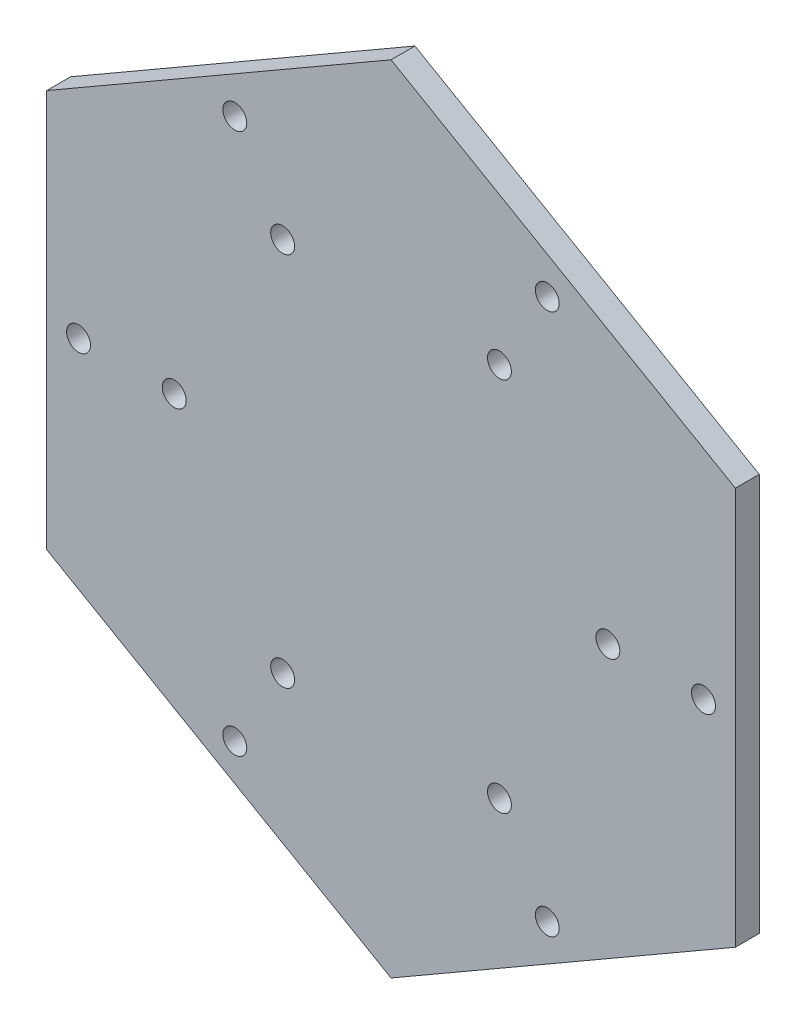
ISO-10303-21;
HEADER;
FILE_DESCRIPTION(('STEP AP214'),'2;1');
FILE_NAME('part.step','',(''),(''),'','','');
FILE_SCHEMA(('AUTOMOTIVE_DESIGN { 1 0 10303 214 1 1 1 1 }'));
ENDSEC;
DATA;
#1=APPLICATION_CONTEXT('core data for automotive mechanical design processes');
#2=APPLICATION_PROTOCOL_DEFINITION('international standard','automotive_design',2000,#1);
#3=PRODUCT_CONTEXT('',#1,'mechanical');
#4=PRODUCT('Part','Part','',(#3));
#5=PRODUCT_RELATED_PRODUCT_CATEGORY('part','',(#4));
#6=PRODUCT_DEFINITION_FORMATION('','',#4);
#7=PRODUCT_DEFINITION_CONTEXT('part definition',#1,'design');
#8=PRODUCT_DEFINITION('design','',#6,#7);
#9=PRODUCT_DEFINITION_SHAPE('','',#8);
#10=(LENGTH_UNIT() NAMED_UNIT(*) SI_UNIT(.MILLI.,.METRE.));
#11=(NAMED_UNIT(*) PLANE_ANGLE_UNIT() SI_UNIT($,.RADIAN.));
#12=(NAMED_UNIT(*) SI_UNIT($,.STERADIAN.) SOLID_ANGLE_UNIT());
#13=UNCERTAINTY_MEASURE_WITH_UNIT(LENGTH_MEASURE(1.E-05),#10,'distance_accuracy_value','');
#14=(GEOMETRIC_REPRESENTATION_CONTEXT(3) GLOBAL_UNCERTAINTY_ASSIGNED_CONTEXT((#13)) GLOBAL_UNIT_ASSIGNED_CONTEXT((#10,
#11,#12)) REPRESENTATION_CONTEXT('',''));
#15=CARTESIAN_POINT('',(0.,0.,0.));
#16=DIRECTION('',(0.,0.,1.));
#17=DIRECTION('',(1.,0.,0.));
#18=AXIS2_PLACEMENT_3D('',#15,#16,#17);
#19=CARTESIAN_POINT('',(-43.2066526290992,-24.9453725261938,3.));
#20=DIRECTION('',(0.499999999999995,0.866025403784441,0.));
#21=DIRECTION('',(-0.866025403784442,0.499999999999995,0.));
#22=AXIS2_PLACEMENT_3D('',#19,#20,#21);
#23=PLANE('',#22);
#24=DIRECTION('',(0.866025403784442,-0.499999999999995,0.));
#25=VECTOR('',#24,1.);
#26=CARTESIAN_POINT('',(-43.2066526290992,-24.9453725261938,0.));
#27=LINE('',#26,#25);
#28=CARTESIAN_POINT('',(-43.2066526290992,-24.9453725261938,0.));
#29=VERTEX_POINT('',#28);
#30=CARTESIAN_POINT('',(0.,-49.8907450523865,0.));
#31=VERTEX_POINT('',#30);
#32=EDGE_CURVE('E128',#29,#31,#27,.T.);
#33=ORIENTED_EDGE('',*,*,#32,.T.);
#34=DIRECTION('',(0.,0.,-1.));
#35=VECTOR('',#34,1.);
#36=CARTESIAN_POINT('',(0.,-49.8907450523865,3.));
#37=LINE('',#36,#35);
#38=CARTESIAN_POINT('',(0.,-49.8907450523865,3.));
#39=VERTEX_POINT('',#38);
#40=EDGE_CURVE('E11',#39,#31,#37,.T.);
#41=ORIENTED_EDGE('',*,*,#40,.F.);
#42=DIRECTION('',(0.866025403784442,-0.499999999999995,0.));
#43=VECTOR('',#42,1.);
#44=CARTESIAN_POINT('',(-43.2066526290992,-24.9453725261938,3.));
#45=LINE('',#44,#43);
#46=CARTESIAN_POINT('',(-43.2066526290992,-24.9453725261938,3.));
#47=VERTEX_POINT('',#46);
#48=EDGE_CURVE('E145',#47,#39,#45,.T.);
#49=ORIENTED_EDGE('',*,*,#48,.F.);
#50=DIRECTION('',(0.,0.,-1.));
#51=VECTOR('',#50,1.);
#52=CARTESIAN_POINT('',(-43.2066526290992,-24.9453725261938,3.));
#53=LINE('',#52,#51);
#54=EDGE_CURVE('E124',#47,#29,#53,.T.);
#55=ORIENTED_EDGE('',*,*,#54,.T.);
#56=EDGE_LOOP('',(#33,#41,#49,#55));
#57=FACE_BOUND('',#56,.T.);
#58=ADVANCED_FACE('F39',(#57),#23,.F.);
#59=CARTESIAN_POINT('',(0.,-49.8907450523865,3.));
#60=DIRECTION('',(-0.500000000000001,0.866025403784438,0.));
#61=DIRECTION('',(-0.866025403784438,-0.500000000000001,0.));
#62=AXIS2_PLACEMENT_3D('',#59,#60,#61);
#63=PLANE('',#62);
#64=DIRECTION('',(0.866025403784438,0.500000000000001,0.));
#65=VECTOR('',#64,1.);
#66=CARTESIAN_POINT('',(0.,-49.8907450523865,0.));
#67=LINE('',#66,#65);
#68=CARTESIAN_POINT('',(43.2066526290996,-24.9453725261932,0.));
#69=VERTEX_POINT('',#68);
#70=EDGE_CURVE('E132',#31,#69,#67,.T.);
#71=ORIENTED_EDGE('',*,*,#70,.T.);
#72=DIRECTION('',(0.,0.,-1.));
#73=VECTOR('',#72,1.);
#74=CARTESIAN_POINT('',(43.2066526290996,-24.9453725261932,3.));
#75=LINE('',#74,#73);
#76=CARTESIAN_POINT('',(43.2066526290996,-24.9453725261932,3.));
#77=VERTEX_POINT('',#76);
#78=EDGE_CURVE('E48',#77,#69,#75,.T.);
#79=ORIENTED_EDGE('',*,*,#78,.F.);
#80=DIRECTION('',(0.866025403784438,0.500000000000001,0.));
#81=VECTOR('',#80,1.);
#82=CARTESIAN_POINT('',(0.,-49.8907450523865,3.));
#83=LINE('',#82,#81);
#84=EDGE_CURVE('E93',#39,#77,#83,.T.);
#85=ORIENTED_EDGE('',*,*,#84,.F.);
#86=ORIENTED_EDGE('',*,*,#40,.T.);
#87=EDGE_LOOP('',(#71,#79,#85,#86));
#88=FACE_BOUND('',#87,.T.);
#89=ADVANCED_FACE('F174',(#88),#63,.F.);
#90=CARTESIAN_POINT('',(43.2066526290996,-24.9453725261932,3.));
#91=DIRECTION('',(-1.,0.,0.));
#92=DIRECTION('',(0.,-1.,0.));
#93=AXIS2_PLACEMENT_3D('',#90,#91,#92);
#94=PLANE('',#93);
#95=DIRECTION('',(0.,1.,0.));
#96=VECTOR('',#95,1.);
#97=CARTESIAN_POINT('',(43.2066526290996,-24.9453725261932,0.));
#98=LINE('',#97,#96);
#99=CARTESIAN_POINT('',(43.2066526290994,24.9453725261935,0.));
#100=VERTEX_POINT('',#99);
#101=EDGE_CURVE('E136',#69,#100,#98,.T.);
#102=ORIENTED_EDGE('',*,*,#101,.T.);
#103=DIRECTION('',(0.,0.,-1.));
#104=VECTOR('',#103,1.);
#105=CARTESIAN_POINT('',(43.2066526290994,24.9453725261935,3.));
#106=LINE('',#105,#104);
#107=CARTESIAN_POINT('',(43.2066526290994,24.9453725261935,3.));
#108=VERTEX_POINT('',#107);
#109=EDGE_CURVE('E117',#108,#100,#106,.T.);
#110=ORIENTED_EDGE('',*,*,#109,.F.);
#111=DIRECTION('',(0.,1.,0.));
#112=VECTOR('',#111,1.);
#113=CARTESIAN_POINT('',(43.2066526290996,-24.9453725261932,3.));
#114=LINE('',#113,#112);
#115=EDGE_CURVE('E106',#77,#108,#114,.T.);
#116=ORIENTED_EDGE('',*,*,#115,.F.);
#117=ORIENTED_EDGE('',*,*,#78,.T.);
#118=EDGE_LOOP('',(#102,#110,#116,#117));
#119=FACE_BOUND('',#118,.T.);
#120=ADVANCED_FACE('F155',(#119),#94,.F.);
#121=CARTESIAN_POINT('',(43.2066526290994,24.9453725261935,3.));
#122=DIRECTION('',(-0.499999999999995,-0.866025403784441,0.));
#123=DIRECTION('',(0.866025403784442,-0.499999999999995,0.));
#124=AXIS2_PLACEMENT_3D('',#121,#122,#123);
#125=PLANE('',#124);
#126=DIRECTION('',(-0.866025403784442,0.499999999999995,0.));
#127=VECTOR('',#126,1.);
#128=CARTESIAN_POINT('',(43.2066526290994,24.9453725261935,0.));
#129=LINE('',#128,#127);
#130=CARTESIAN_POINT('',(-3.48385210662776E-13,49.8907450523865,0.));
#131=VERTEX_POINT('',#130);
#132=EDGE_CURVE('E115',#100,#131,#129,.T.);
#133=ORIENTED_EDGE('',*,*,#132,.T.);
#134=DIRECTION('',(0.,0.,-1.));
#135=VECTOR('',#134,1.);
#136=CARTESIAN_POINT('',(-3.48385210662776E-13,49.8907450523865,3.));
#137=LINE('',#136,#135);
#138=CARTESIAN_POINT('',(-3.48385210662776E-13,49.8907450523865,3.));
#139=VERTEX_POINT('',#138);
#140=EDGE_CURVE('E112',#139,#131,#137,.T.);
#141=ORIENTED_EDGE('',*,*,#140,.F.);
#142=DIRECTION('',(-0.866025403784442,0.499999999999995,0.));
#143=VECTOR('',#142,1.);
#144=CARTESIAN_POINT('',(43.2066526290994,24.9453725261935,3.));
#145=LINE('',#144,#143);
#146=EDGE_CURVE('E100',#108,#139,#145,.T.);
#147=ORIENTED_EDGE('',*,*,#146,.F.);
#148=ORIENTED_EDGE('',*,*,#109,.T.);
#149=EDGE_LOOP('',(#133,#141,#147,#148));
#150=FACE_BOUND('',#149,.T.);
#151=ADVANCED_FACE('F113',(#150),#125,.F.);
#152=CARTESIAN_POINT('',(-3.48385210662776E-13,49.8907450523865,3.));
#153=DIRECTION('',(0.500000000000007,-0.866025403784435,0.));
#154=DIRECTION('',(0.866025403784434,0.500000000000007,0.));
#155=AXIS2_PLACEMENT_3D('',#152,#153,#154);
#156=PLANE('',#155);
#157=DIRECTION('',(-0.866025403784435,-0.500000000000007,0.));
#158=VECTOR('',#157,1.);
#159=CARTESIAN_POINT('',(-3.48385210662776E-13,49.8907450523865,0.));
#160=LINE('',#159,#158);
#161=CARTESIAN_POINT('',(-43.2066526290997,24.9453725261929,0.));
#162=VERTEX_POINT('',#161);
#163=EDGE_CURVE('E79',#131,#162,#160,.T.);
#164=ORIENTED_EDGE('',*,*,#163,.T.);
#165=DIRECTION('',(0.,0.,-1.));
#166=VECTOR('',#165,1.);
#167=CARTESIAN_POINT('',(-43.2066526290997,24.9453725261929,3.));
#168=LINE('',#167,#166);
#169=CARTESIAN_POINT('',(-43.2066526290997,24.9453725261929,3.));
#170=VERTEX_POINT('',#169);
#171=EDGE_CURVE('E118',#170,#162,#168,.T.);
#172=ORIENTED_EDGE('',*,*,#171,.F.);
#173=DIRECTION('',(-0.866025403784435,-0.500000000000007,0.));
#174=VECTOR('',#173,1.);
#175=CARTESIAN_POINT('',(-3.48385210662776E-13,49.8907450523865,3.));
#176=LINE('',#175,#174);
#177=EDGE_CURVE('E104',#139,#170,#176,.T.);
#178=ORIENTED_EDGE('',*,*,#177,.F.);
#179=ORIENTED_EDGE('',*,*,#140,.T.);
#180=EDGE_LOOP('',(#164,#172,#178,#179));
#181=FACE_BOUND('',#180,.T.);
#182=ADVANCED_FACE('F120',(#181),#156,.F.);
#183=CARTESIAN_POINT('',(-43.2066526290997,24.9453725261929,3.));
#184=DIRECTION('',(1.,0.,0.));
#185=DIRECTION('',(0.,1.,0.));
#186=AXIS2_PLACEMENT_3D('',#183,#184,#185);
#187=PLANE('',#186);
#188=DIRECTION('',(0.,-1.,0.));
#189=VECTOR('',#188,1.);
#190=CARTESIAN_POINT('',(-43.2066526290997,24.9453725261929,0.));
#191=LINE('',#190,#189);
#192=EDGE_CURVE('E85',#162,#29,#191,.T.);
#193=ORIENTED_EDGE('',*,*,#192,.T.);
#194=ORIENTED_EDGE('',*,*,#54,.F.);
#195=DIRECTION('',(0.,-1.,0.));
#196=VECTOR('',#195,1.);
#197=CARTESIAN_POINT('',(-43.2066526290997,24.9453725261929,3.));
#198=LINE('',#197,#196);
#199=EDGE_CURVE('E56',#170,#47,#198,.T.);
#200=ORIENTED_EDGE('',*,*,#199,.F.);
#201=ORIENTED_EDGE('',*,*,#171,.T.);
#202=EDGE_LOOP('',(#193,#194,#200,#201));
#203=FACE_BOUND('',#202,.T.);
#204=ADVANCED_FACE('F162',(#203),#187,.F.);
#205=CARTESIAN_POINT('',(0.,0.,3.));
#206=DIRECTION('',(0.,0.,1.));
#207=DIRECTION('',(1.,0.,0.));
#208=AXIS2_PLACEMENT_3D('',#205,#206,#207);
#209=PLANE('',#208);
#210=CARTESIAN_POINT('',(-19.6033263145499,-33.9539571741521,3.));
#211=DIRECTION('',(0.,0.,1.));
#212=DIRECTION('',(1.,0.,0.));
#213=AXIS2_PLACEMENT_3D('',#210,#211,#212);
#214=CIRCLE('',#213,1.5);
#215=CARTESIAN_POINT('',(-18.1033263145499,-33.9539571741521,3.));
#216=VERTEX_POINT('',#215);
#217=EDGE_CURVE('E340',#216,#216,#214,.T.);
#218=ORIENTED_EDGE('',*,*,#217,.F.);
#219=EDGE_LOOP('',(#218));
#220=FACE_BOUND('',#219,.T.);
#221=CARTESIAN_POINT('',(-27.2066526290996,1.89983039893777E-13,3.));
#222=DIRECTION('',(0.,0.,1.));
#223=DIRECTION('',(1.,0.,0.));
#224=AXIS2_PLACEMENT_3D('',#221,#222,#223);
#225=CIRCLE('',#224,1.5);
#226=CARTESIAN_POINT('',(-25.7066526290996,1.89983039893777E-13,3.));
#227=VERTEX_POINT('',#226);
#228=EDGE_CURVE('E349',#227,#227,#225,.T.);
#229=ORIENTED_EDGE('',*,*,#228,.F.);
#230=EDGE_LOOP('',(#229));
#231=FACE_BOUND('',#230,.T.);
#232=CARTESIAN_POINT('',(-39.2066526290996,2.73778592026012E-13,3.));
#233=DIRECTION('',(0.,0.,1.));
#234=DIRECTION('',(1.,0.,0.));
#235=AXIS2_PLACEMENT_3D('',#232,#233,#234);
#236=CIRCLE('',#235,1.5);
#237=CARTESIAN_POINT('',(-37.7066526290996,2.73778592026012E-13,3.));
#238=VERTEX_POINT('',#237);
#239=EDGE_CURVE('E435',#238,#238,#236,.T.);
#240=ORIENTED_EDGE('',*,*,#239,.F.);
#241=EDGE_LOOP('',(#240));
#242=FACE_BOUND('',#241,.T.);
#243=CARTESIAN_POINT('',(-13.6033263145496,23.561652328739,3.));
#244=DIRECTION('',(0.,0.,1.));
#245=DIRECTION('',(1.,0.,0.));
#246=AXIS2_PLACEMENT_3D('',#243,#244,#245);
#247=CIRCLE('',#246,1.5);
#248=CARTESIAN_POINT('',(-12.1033263145496,23.561652328739,3.));
#249=VERTEX_POINT('',#248);
#250=EDGE_CURVE('E442',#249,#249,#247,.T.);
#251=ORIENTED_EDGE('',*,*,#250,.F.);
#252=EDGE_LOOP('',(#251));
#253=FACE_BOUND('',#252,.T.);
#254=CARTESIAN_POINT('',(39.2066526290996,0.,3.));
#255=DIRECTION('',(0.,0.,1.));
#256=DIRECTION('',(1.,0.,0.));
#257=AXIS2_PLACEMENT_3D('',#254,#255,#256);
#258=CIRCLE('',#257,1.5);
#259=CARTESIAN_POINT('',(40.7066526290996,0.,3.));
#260=VERTEX_POINT('',#259);
#261=EDGE_CURVE('E378',#260,#260,#258,.T.);
#262=ORIENTED_EDGE('',*,*,#261,.F.);
#263=EDGE_LOOP('',(#262));
#264=FACE_BOUND('',#263,.T.);
#265=CARTESIAN_POINT('',(13.6033263145497,-23.5616523287389,3.));
#266=DIRECTION('',(0.,0.,1.));
#267=DIRECTION('',(1.,0.,0.));
#268=AXIS2_PLACEMENT_3D('',#265,#266,#267);
#269=CIRCLE('',#268,1.5);
#270=CARTESIAN_POINT('',(15.1033263145497,-23.5616523287389,3.));
#271=VERTEX_POINT('',#270);
#272=EDGE_CURVE('E361',#271,#271,#269,.T.);
#273=ORIENTED_EDGE('',*,*,#272,.F.);
#274=EDGE_LOOP('',(#273));
#275=FACE_BOUND('',#274,.T.);
#276=CARTESIAN_POINT('',(19.6033263145497,-33.9539571741522,3.));
#277=DIRECTION('',(0.,0.,1.));
#278=DIRECTION('',(1.,0.,0.));
#279=AXIS2_PLACEMENT_3D('',#276,#277,#278);
#280=CIRCLE('',#279,1.5);
#281=CARTESIAN_POINT('',(21.1033263145497,-33.9539571741522,3.));
#282=VERTEX_POINT('',#281);
#283=EDGE_CURVE('E362',#282,#282,#280,.T.);
#284=ORIENTED_EDGE('',*,*,#283,.F.);
#285=EDGE_LOOP('',(#284));
#286=FACE_BOUND('',#285,.T.);
#287=CARTESIAN_POINT('',(-13.6033263145499,-23.5616523287389,3.));
#288=DIRECTION('',(0.,0.,1.));
#289=DIRECTION('',(1.,0.,0.));
#290=AXIS2_PLACEMENT_3D('',#287,#288,#289);
#291=CIRCLE('',#290,1.5);
#292=CARTESIAN_POINT('',(-12.1033263145499,-23.5616523287389,3.));
#293=VERTEX_POINT('',#292);
#294=EDGE_CURVE('E346',#293,#293,#291,.T.);
#295=ORIENTED_EDGE('',*,*,#294,.F.);
#296=EDGE_LOOP('',(#295));
#297=FACE_BOUND('',#296,.T.);
#298=CARTESIAN_POINT('',(-19.6033263145495,33.9539571741524,3.));
#299=DIRECTION('',(0.,0.,1.));
#300=DIRECTION('',(1.,0.,0.));
#301=AXIS2_PLACEMENT_3D('',#298,#299,#300);
#302=CIRCLE('',#301,1.50000000000001);
#303=CARTESIAN_POINT('',(-18.1033263145495,33.9539571741524,3.));
#304=VERTEX_POINT('',#303);
#305=EDGE_CURVE('E415',#304,#304,#302,.T.);
#306=ORIENTED_EDGE('',*,*,#305,.F.);
#307=EDGE_LOOP('',(#306));
#308=FACE_BOUND('',#307,.T.);
#309=CARTESIAN_POINT('',(13.6033263145501,23.5616523287388,3.));
#310=DIRECTION('',(0.,0.,1.));
#311=DIRECTION('',(1.,0.,0.));
#312=AXIS2_PLACEMENT_3D('',#309,#310,#311);
#313=CIRCLE('',#312,1.5);
#314=CARTESIAN_POINT('',(15.1033263145501,23.5616523287388,3.));
#315=VERTEX_POINT('',#314);
#316=EDGE_CURVE('E419',#315,#315,#313,.T.);
#317=ORIENTED_EDGE('',*,*,#316,.F.);
#318=EDGE_LOOP('',(#317));
#319=FACE_BOUND('',#318,.T.);
#320=CARTESIAN_POINT('',(19.6033263145502,33.953957174152,3.));
#321=DIRECTION('',(0.,0.,1.));
#322=DIRECTION('',(1.,0.,0.));
#323=AXIS2_PLACEMENT_3D('',#320,#321,#322);
#324=CIRCLE('',#323,1.50000000000001);
#325=CARTESIAN_POINT('',(21.1033263145502,33.953957174152,3.));
#326=VERTEX_POINT('',#325);
#327=EDGE_CURVE('E422',#326,#326,#324,.T.);
#328=ORIENTED_EDGE('',*,*,#327,.F.);
#329=EDGE_LOOP('',(#328));
#330=FACE_BOUND('',#329,.T.);
#331=CARTESIAN_POINT('',(27.2066526290996,0.,3.));
#332=DIRECTION('',(0.,0.,1.));
#333=DIRECTION('',(1.,0.,0.));
#334=AXIS2_PLACEMENT_3D('',#331,#332,#333);
#335=CIRCLE('',#334,1.5);
#336=CARTESIAN_POINT('',(28.7066526290996,0.,3.));
#337=VERTEX_POINT('',#336);
#338=EDGE_CURVE('E377',#337,#337,#335,.T.);
#339=ORIENTED_EDGE('',*,*,#338,.F.);
#340=EDGE_LOOP('',(#339));
#341=FACE_BOUND('',#340,.T.);
#342=ORIENTED_EDGE('',*,*,#48,.T.);
#343=ORIENTED_EDGE('',*,*,#84,.T.);
#344=ORIENTED_EDGE('',*,*,#115,.T.);
#345=ORIENTED_EDGE('',*,*,#146,.T.);
#346=ORIENTED_EDGE('',*,*,#177,.T.);
#347=ORIENTED_EDGE('',*,*,#199,.T.);
#348=EDGE_LOOP('',(#342,#343,#344,#345,#346,#347));
#349=FACE_BOUND('',#348,.T.);
#350=ADVANCED_FACE('F102',(#220,#231,#242,#253,#264,#275,#286,#297,#308,#319,#330,#341,#349),
#209,.T.);
#351=CARTESIAN_POINT('',(0.,0.,0.));
#352=DIRECTION('',(0.,0.,1.));
#353=DIRECTION('',(1.,0.,0.));
#354=AXIS2_PLACEMENT_3D('',#351,#352,#353);
#355=PLANE('',#354);
#356=CARTESIAN_POINT('',(-19.6033263145499,-33.9539571741521,0.));
#357=DIRECTION('',(0.,0.,1.));
#358=DIRECTION('',(1.,0.,0.));
#359=AXIS2_PLACEMENT_3D('',#356,#357,#358);
#360=CIRCLE('',#359,1.5);
#361=CARTESIAN_POINT('',(-18.1033263145499,-33.9539571741521,0.));
#362=VERTEX_POINT('',#361);
#363=EDGE_CURVE('E337',#362,#362,#360,.T.);
#364=ORIENTED_EDGE('',*,*,#363,.T.);
#365=EDGE_LOOP('',(#364));
#366=FACE_BOUND('',#365,.T.);
#367=CARTESIAN_POINT('',(-27.2066526290996,1.89983039893777E-13,0.));
#368=DIRECTION('',(0.,0.,1.));
#369=DIRECTION('',(1.,0.,0.));
#370=AXIS2_PLACEMENT_3D('',#367,#368,#369);
#371=CIRCLE('',#370,1.5);
#372=CARTESIAN_POINT('',(-25.7066526290996,1.89983039893777E-13,0.));
#373=VERTEX_POINT('',#372);
#374=EDGE_CURVE('E342',#373,#373,#371,.T.);
#375=ORIENTED_EDGE('',*,*,#374,.T.);
#376=EDGE_LOOP('',(#375));
#377=FACE_BOUND('',#376,.T.);
#378=CARTESIAN_POINT('',(-39.2066526290996,2.73778592026012E-13,0.));
#379=DIRECTION('',(0.,0.,1.));
#380=DIRECTION('',(1.,0.,0.));
#381=AXIS2_PLACEMENT_3D('',#378,#379,#380);
#382=CIRCLE('',#381,1.5);
#383=CARTESIAN_POINT('',(-37.7066526290996,2.73778592026012E-13,0.));
#384=VERTEX_POINT('',#383);
#385=EDGE_CURVE('E356',#384,#384,#382,.T.);
#386=ORIENTED_EDGE('',*,*,#385,.T.);
#387=EDGE_LOOP('',(#386));
#388=FACE_BOUND('',#387,.T.);
#389=CARTESIAN_POINT('',(-13.6033263145496,23.561652328739,0.));
#390=DIRECTION('',(0.,0.,1.));
#391=DIRECTION('',(1.,0.,0.));
#392=AXIS2_PLACEMENT_3D('',#389,#390,#391);
#393=CIRCLE('',#392,1.5);
#394=CARTESIAN_POINT('',(-12.1033263145496,23.561652328739,0.));
#395=VERTEX_POINT('',#394);
#396=EDGE_CURVE('E439',#395,#395,#393,.T.);
#397=ORIENTED_EDGE('',*,*,#396,.T.);
#398=EDGE_LOOP('',(#397));
#399=FACE_BOUND('',#398,.T.);
#400=CARTESIAN_POINT('',(39.2066526290996,0.,0.));
#401=DIRECTION('',(0.,0.,1.));
#402=DIRECTION('',(1.,0.,0.));
#403=AXIS2_PLACEMENT_3D('',#400,#401,#402);
#404=CIRCLE('',#403,1.5);
#405=CARTESIAN_POINT('',(40.7066526290996,0.,0.));
#406=VERTEX_POINT('',#405);
#407=EDGE_CURVE('E373',#406,#406,#404,.T.);
#408=ORIENTED_EDGE('',*,*,#407,.T.);
#409=EDGE_LOOP('',(#408));
#410=FACE_BOUND('',#409,.T.);
#411=CARTESIAN_POINT('',(13.6033263145497,-23.5616523287389,0.));
#412=DIRECTION('',(0.,0.,1.));
#413=DIRECTION('',(1.,0.,0.));
#414=AXIS2_PLACEMENT_3D('',#411,#412,#413);
#415=CIRCLE('',#414,1.5);
#416=CARTESIAN_POINT('',(15.1033263145497,-23.5616523287389,0.));
#417=VERTEX_POINT('',#416);
#418=EDGE_CURVE('E382',#417,#417,#415,.T.);
#419=ORIENTED_EDGE('',*,*,#418,.T.);
#420=EDGE_LOOP('',(#419));
#421=FACE_BOUND('',#420,.T.);
#422=CARTESIAN_POINT('',(19.6033263145497,-33.9539571741522,0.));
#423=DIRECTION('',(0.,0.,1.));
#424=DIRECTION('',(1.,0.,0.));
#425=AXIS2_PLACEMENT_3D('',#422,#423,#424);
#426=CIRCLE('',#425,1.5);
#427=CARTESIAN_POINT('',(21.1033263145497,-33.9539571741522,0.));
#428=VERTEX_POINT('',#427);
#429=EDGE_CURVE('E357',#428,#428,#426,.T.);
#430=ORIENTED_EDGE('',*,*,#429,.T.);
#431=EDGE_LOOP('',(#430));
#432=FACE_BOUND('',#431,.T.);
#433=CARTESIAN_POINT('',(-13.6033263145499,-23.5616523287389,0.));
#434=DIRECTION('',(0.,0.,1.));
#435=DIRECTION('',(1.,0.,0.));
#436=AXIS2_PLACEMENT_3D('',#433,#434,#435);
#437=CIRCLE('',#436,1.5);
#438=CARTESIAN_POINT('',(-12.1033263145499,-23.5616523287389,0.));
#439=VERTEX_POINT('',#438);
#440=EDGE_CURVE('E366',#439,#439,#437,.T.);
#441=ORIENTED_EDGE('',*,*,#440,.T.);
#442=EDGE_LOOP('',(#441));
#443=FACE_BOUND('',#442,.T.);
#444=CARTESIAN_POINT('',(-19.6033263145495,33.9539571741524,0.));
#445=DIRECTION('',(0.,0.,1.));
#446=DIRECTION('',(1.,0.,0.));
#447=AXIS2_PLACEMENT_3D('',#444,#445,#446);
#448=CIRCLE('',#447,1.50000000000001);
#449=CARTESIAN_POINT('',(-18.1033263145495,33.9539571741524,0.));
#450=VERTEX_POINT('',#449);
#451=EDGE_CURVE('E445',#450,#450,#448,.T.);
#452=ORIENTED_EDGE('',*,*,#451,.T.);
#453=EDGE_LOOP('',(#452));
#454=FACE_BOUND('',#453,.T.);
#455=CARTESIAN_POINT('',(13.6033263145501,23.5616523287388,0.));
#456=DIRECTION('',(0.,0.,1.));
#457=DIRECTION('',(1.,0.,0.));
#458=AXIS2_PLACEMENT_3D('',#455,#456,#457);
#459=CIRCLE('',#458,1.5);
#460=CARTESIAN_POINT('',(15.1033263145501,23.5616523287388,0.));
#461=VERTEX_POINT('',#460);
#462=EDGE_CURVE('E454',#461,#461,#459,.T.);
#463=ORIENTED_EDGE('',*,*,#462,.T.);
#464=EDGE_LOOP('',(#463));
#465=FACE_BOUND('',#464,.T.);
#466=CARTESIAN_POINT('',(19.6033263145502,33.953957174152,0.));
#467=DIRECTION('',(0.,0.,1.));
#468=DIRECTION('',(1.,0.,0.));
#469=AXIS2_PLACEMENT_3D('',#466,#467,#468);
#470=CIRCLE('',#469,1.50000000000001);
#471=CARTESIAN_POINT('',(21.1033263145502,33.953957174152,0.));
#472=VERTEX_POINT('',#471);
#473=EDGE_CURVE('E425',#472,#472,#470,.T.);
#474=ORIENTED_EDGE('',*,*,#473,.T.);
#475=EDGE_LOOP('',(#474));
#476=FACE_BOUND('',#475,.T.);
#477=CARTESIAN_POINT('',(27.2066526290996,0.,0.));
#478=DIRECTION('',(0.,0.,1.));
#479=DIRECTION('',(1.,0.,0.));
#480=AXIS2_PLACEMENT_3D('',#477,#478,#479);
#481=CIRCLE('',#480,1.5);
#482=CARTESIAN_POINT('',(28.7066526290996,0.,0.));
#483=VERTEX_POINT('',#482);
#484=EDGE_CURVE('E133',#483,#483,#481,.T.);
#485=ORIENTED_EDGE('',*,*,#484,.T.);
#486=EDGE_LOOP('',(#485));
#487=FACE_BOUND('',#486,.T.);
#488=ORIENTED_EDGE('',*,*,#32,.F.);
#489=ORIENTED_EDGE('',*,*,#192,.F.);
#490=ORIENTED_EDGE('',*,*,#163,.F.);
#491=ORIENTED_EDGE('',*,*,#132,.F.);
#492=ORIENTED_EDGE('',*,*,#101,.F.);
#493=ORIENTED_EDGE('',*,*,#70,.F.);
#494=EDGE_LOOP('',(#488,#489,#490,#491,#492,#493));
#495=FACE_BOUND('',#494,.T.);
#496=ADVANCED_FACE('F158',(#366,#377,#388,#399,#410,#421,#432,#443,#454,#465,#476,#487,#495),
#355,.F.);
#497=CARTESIAN_POINT('',(27.2066526290996,0.,0.));
#498=DIRECTION('',(0.,0.,1.));
#499=DIRECTION('',(1.,0.,0.));
#500=AXIS2_PLACEMENT_3D('',#497,#498,#499);
#501=CYLINDRICAL_SURFACE('',#500,1.5);
#502=ORIENTED_EDGE('',*,*,#484,.F.);
#503=EDGE_LOOP('',(#502));
#504=FACE_BOUND('',#503,.T.);
#505=ORIENTED_EDGE('',*,*,#338,.T.);
#506=EDGE_LOOP('',(#505));
#507=FACE_BOUND('',#506,.T.);
#508=ADVANCED_FACE('F211',(#504,#507),#501,.F.);
#509=CARTESIAN_POINT('',(19.6033263145502,33.953957174152,0.));
#510=DIRECTION('',(0.,0.,1.));
#511=DIRECTION('',(1.,0.,0.));
#512=AXIS2_PLACEMENT_3D('',#509,#510,#511);
#513=CYLINDRICAL_SURFACE('',#512,1.50000000000001);
#514=ORIENTED_EDGE('',*,*,#473,.F.);
#515=EDGE_LOOP('',(#514));
#516=FACE_BOUND('',#515,.T.);
#517=ORIENTED_EDGE('',*,*,#327,.T.);
#518=EDGE_LOOP('',(#517));
#519=FACE_BOUND('',#518,.T.);
#520=ADVANCED_FACE('F220',(#516,#519),#513,.F.);
#521=CARTESIAN_POINT('',(13.6033263145501,23.5616523287388,0.));
#522=DIRECTION('',(0.,0.,1.));
#523=DIRECTION('',(1.,0.,0.));
#524=AXIS2_PLACEMENT_3D('',#521,#522,#523);
#525=CYLINDRICAL_SURFACE('',#524,1.5);
#526=ORIENTED_EDGE('',*,*,#462,.F.);
#527=EDGE_LOOP('',(#526));
#528=FACE_BOUND('',#527,.T.);
#529=ORIENTED_EDGE('',*,*,#316,.T.);
#530=EDGE_LOOP('',(#529));
#531=FACE_BOUND('',#530,.T.);
#532=ADVANCED_FACE('F230',(#528,#531),#525,.F.);
#533=CARTESIAN_POINT('',(-19.6033263145495,33.9539571741524,0.));
#534=DIRECTION('',(0.,0.,1.));
#535=DIRECTION('',(1.,0.,0.));
#536=AXIS2_PLACEMENT_3D('',#533,#534,#535);
#537=CYLINDRICAL_SURFACE('',#536,1.50000000000001);
#538=ORIENTED_EDGE('',*,*,#451,.F.);
#539=EDGE_LOOP('',(#538));
#540=FACE_BOUND('',#539,.T.);
#541=ORIENTED_EDGE('',*,*,#305,.T.);
#542=EDGE_LOOP('',(#541));
#543=FACE_BOUND('',#542,.T.);
#544=ADVANCED_FACE('F240',(#540,#543),#537,.F.);
#545=CARTESIAN_POINT('',(-13.6033263145499,-23.5616523287389,0.));
#546=DIRECTION('',(0.,0.,1.));
#547=DIRECTION('',(1.,0.,0.));
#548=AXIS2_PLACEMENT_3D('',#545,#546,#547);
#549=CYLINDRICAL_SURFACE('',#548,1.5);
#550=ORIENTED_EDGE('',*,*,#440,.F.);
#551=EDGE_LOOP('',(#550));
#552=FACE_BOUND('',#551,.T.);
#553=ORIENTED_EDGE('',*,*,#294,.T.);
#554=EDGE_LOOP('',(#553));
#555=FACE_BOUND('',#554,.T.);
#556=ADVANCED_FACE('F250',(#552,#555),#549,.F.);
#557=CARTESIAN_POINT('',(19.6033263145497,-33.9539571741522,0.));
#558=DIRECTION('',(0.,0.,1.));
#559=DIRECTION('',(1.,0.,0.));
#560=AXIS2_PLACEMENT_3D('',#557,#558,#559);
#561=CYLINDRICAL_SURFACE('',#560,1.5);
#562=ORIENTED_EDGE('',*,*,#429,.F.);
#563=EDGE_LOOP('',(#562));
#564=FACE_BOUND('',#563,.T.);
#565=ORIENTED_EDGE('',*,*,#283,.T.);
#566=EDGE_LOOP('',(#565));
#567=FACE_BOUND('',#566,.T.);
#568=ADVANCED_FACE('F260',(#564,#567),#561,.F.);
#569=CARTESIAN_POINT('',(13.6033263145497,-23.5616523287389,0.));
#570=DIRECTION('',(0.,0.,1.));
#571=DIRECTION('',(1.,0.,0.));
#572=AXIS2_PLACEMENT_3D('',#569,#570,#571);
#573=CYLINDRICAL_SURFACE('',#572,1.5);
#574=ORIENTED_EDGE('',*,*,#418,.F.);
#575=EDGE_LOOP('',(#574));
#576=FACE_BOUND('',#575,.T.);
#577=ORIENTED_EDGE('',*,*,#272,.T.);
#578=EDGE_LOOP('',(#577));
#579=FACE_BOUND('',#578,.T.);
#580=ADVANCED_FACE('F270',(#576,#579),#573,.F.);
#581=CARTESIAN_POINT('',(39.2066526290996,0.,0.));
#582=DIRECTION('',(0.,0.,1.));
#583=DIRECTION('',(1.,0.,0.));
#584=AXIS2_PLACEMENT_3D('',#581,#582,#583);
#585=CYLINDRICAL_SURFACE('',#584,1.5);
#586=ORIENTED_EDGE('',*,*,#407,.F.);
#587=EDGE_LOOP('',(#586));
#588=FACE_BOUND('',#587,.T.);
#589=ORIENTED_EDGE('',*,*,#261,.T.);
#590=EDGE_LOOP('',(#589));
#591=FACE_BOUND('',#590,.T.);
#592=ADVANCED_FACE('F280',(#588,#591),#585,.F.);
#593=CARTESIAN_POINT('',(-13.6033263145496,23.561652328739,0.));
#594=DIRECTION('',(0.,0.,1.));
#595=DIRECTION('',(1.,0.,0.));
#596=AXIS2_PLACEMENT_3D('',#593,#594,#595);
#597=CYLINDRICAL_SURFACE('',#596,1.5);
#598=ORIENTED_EDGE('',*,*,#396,.F.);
#599=EDGE_LOOP('',(#598));
#600=FACE_BOUND('',#599,.T.);
#601=ORIENTED_EDGE('',*,*,#250,.T.);
#602=EDGE_LOOP('',(#601));
#603=FACE_BOUND('',#602,.T.);
#604=ADVANCED_FACE('F290',(#600,#603),#597,.F.);
#605=CARTESIAN_POINT('',(-39.2066526290996,2.73778592026012E-13,0.));
#606=DIRECTION('',(0.,0.,1.));
#607=DIRECTION('',(1.,0.,0.));
#608=AXIS2_PLACEMENT_3D('',#605,#606,#607);
#609=CYLINDRICAL_SURFACE('',#608,1.5);
#610=ORIENTED_EDGE('',*,*,#385,.F.);
#611=EDGE_LOOP('',(#610));
#612=FACE_BOUND('',#611,.T.);
#613=ORIENTED_EDGE('',*,*,#239,.T.);
#614=EDGE_LOOP('',(#613));
#615=FACE_BOUND('',#614,.T.);
#616=ADVANCED_FACE('F300',(#612,#615),#609,.F.);
#617=CARTESIAN_POINT('',(-27.2066526290996,1.89983039893777E-13,0.));
#618=DIRECTION('',(0.,0.,1.));
#619=DIRECTION('',(1.,0.,0.));
#620=AXIS2_PLACEMENT_3D('',#617,#618,#619);
#621=CYLINDRICAL_SURFACE('',#620,1.5);
#622=ORIENTED_EDGE('',*,*,#374,.F.);
#623=EDGE_LOOP('',(#622));
#624=FACE_BOUND('',#623,.T.);
#625=ORIENTED_EDGE('',*,*,#228,.T.);
#626=EDGE_LOOP('',(#625));
#627=FACE_BOUND('',#626,.T.);
#628=ADVANCED_FACE('F310',(#624,#627),#621,.F.);
#629=CARTESIAN_POINT('',(-19.6033263145499,-33.9539571741521,0.));
#630=DIRECTION('',(0.,0.,1.));
#631=DIRECTION('',(1.,0.,0.));
#632=AXIS2_PLACEMENT_3D('',#629,#630,#631);
#633=CYLINDRICAL_SURFACE('',#632,1.5);
#634=ORIENTED_EDGE('',*,*,#363,.F.);
#635=EDGE_LOOP('',(#634));
#636=FACE_BOUND('',#635,.T.);
#637=ORIENTED_EDGE('',*,*,#217,.T.);
#638=EDGE_LOOP('',(#637));
#639=FACE_BOUND('',#638,.T.);
#640=ADVANCED_FACE('F320',(#636,#639),#633,.F.);
#641=CLOSED_SHELL('',(#58,#89,#120,#151,#182,#204,#350,#496,#508,#520,#532,#544,#556,#568,#580,
#592,#604,#616,#628,#640));
#642=MANIFOLD_SOLID_BREP('B2',#641);
#643=ADVANCED_BREP_SHAPE_REPRESENTATION('',(#18,#642),#14);
#644=SHAPE_DEFINITION_REPRESENTATION(#9,#643);
ENDSEC;
END-ISO-10303-21;
